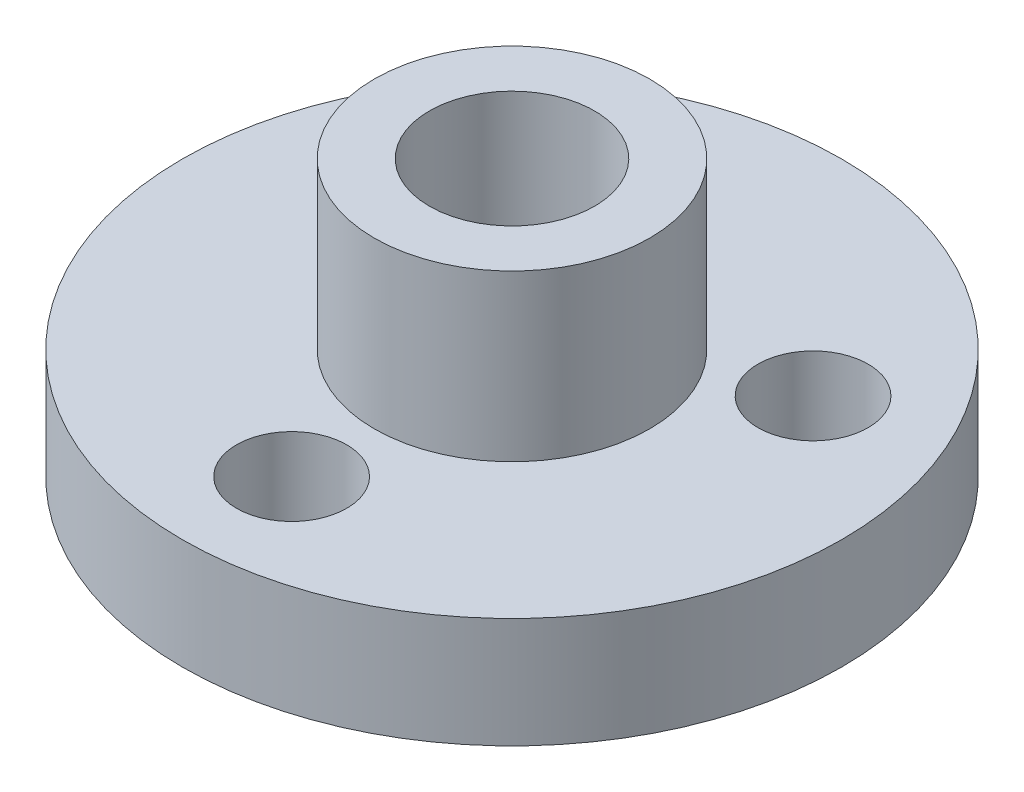
ISO-10303-21;
HEADER;
FILE_DESCRIPTION(('STEP AP214'),'2;1');
FILE_NAME('part.step','',(''),(''),'','','');
FILE_SCHEMA(('AUTOMOTIVE_DESIGN { 1 0 10303 214 1 1 1 1 }'));
ENDSEC;
DATA;
#1=APPLICATION_CONTEXT('core data for automotive mechanical design processes');
#2=APPLICATION_PROTOCOL_DEFINITION('international standard','automotive_design',2000,#1);
#3=PRODUCT_CONTEXT('',#1,'mechanical');
#4=PRODUCT('Part','Part','',(#3));
#5=PRODUCT_RELATED_PRODUCT_CATEGORY('part','',(#4));
#6=PRODUCT_DEFINITION_FORMATION('','',#4);
#7=PRODUCT_DEFINITION_CONTEXT('part definition',#1,'design');
#8=PRODUCT_DEFINITION('design','',#6,#7);
#9=PRODUCT_DEFINITION_SHAPE('','',#8);
#10=(LENGTH_UNIT() NAMED_UNIT(*) SI_UNIT(.MILLI.,.METRE.));
#11=(NAMED_UNIT(*) PLANE_ANGLE_UNIT() SI_UNIT($,.RADIAN.));
#12=(NAMED_UNIT(*) SI_UNIT($,.STERADIAN.) SOLID_ANGLE_UNIT());
#13=UNCERTAINTY_MEASURE_WITH_UNIT(LENGTH_MEASURE(1.E-05),#10,'distance_accuracy_value','');
#14=(GEOMETRIC_REPRESENTATION_CONTEXT(3) GLOBAL_UNCERTAINTY_ASSIGNED_CONTEXT((#13)) GLOBAL_UNIT_ASSIGNED_CONTEXT((#10,
#11,#12)) REPRESENTATION_CONTEXT('',''));
#15=CARTESIAN_POINT('',(0.,0.,0.));
#16=DIRECTION('',(0.,0.,1.));
#17=DIRECTION('',(1.,0.,0.));
#18=AXIS2_PLACEMENT_3D('',#15,#16,#17);
#19=CARTESIAN_POINT('',(0.,3.18,0.));
#20=DIRECTION('',(0.,-1.,0.));
#21=DIRECTION('',(0.,0.,-1.));
#22=AXIS2_PLACEMENT_3D('',#19,#20,#21);
#23=CYLINDRICAL_SURFACE('',#22,9.5);
#24=CARTESIAN_POINT('',(0.,3.18,0.));
#25=DIRECTION('',(0.,1.,0.));
#26=DIRECTION('',(0.,0.,1.));
#27=AXIS2_PLACEMENT_3D('',#24,#25,#26);
#28=CIRCLE('',#27,9.5);
#29=CARTESIAN_POINT('',(0.,3.18,-9.5));
#30=VERTEX_POINT('',#29);
#31=EDGE_CURVE('E10',#30,#30,#28,.T.);
#32=CARTESIAN_POINT('',(0.,0.,0.));
#33=DIRECTION('',(0.,1.,0.));
#34=DIRECTION('',(0.,0.,1.));
#35=AXIS2_PLACEMENT_3D('',#32,#33,#34);
#36=CIRCLE('',#35,9.5);
#37=CARTESIAN_POINT('',(0.,0.,-9.5));
#38=VERTEX_POINT('',#37);
#39=EDGE_CURVE('E34',#38,#38,#36,.T.);
#40=CARTESIAN_POINT('',(0.,3.18,-9.5));
#41=CARTESIAN_POINT('',(0.,3.146875,-9.5));
#42=CARTESIAN_POINT('',(0.,3.11375,-9.5));
#43=CARTESIAN_POINT('',(0.,3.0475,-9.5));
#44=CARTESIAN_POINT('',(0.,3.014375,-9.5));
#45=CARTESIAN_POINT('',(0.,2.948125,-9.5));
#46=CARTESIAN_POINT('',(0.,2.915,-9.5));
#47=CARTESIAN_POINT('',(0.,2.84875,-9.5));
#48=CARTESIAN_POINT('',(0.,2.815625,-9.5));
#49=CARTESIAN_POINT('',(0.,2.749375,-9.5));
#50=CARTESIAN_POINT('',(0.,2.71625,-9.5));
#51=CARTESIAN_POINT('',(0.,2.65,-9.5));
#52=CARTESIAN_POINT('',(0.,2.616875,-9.5));
#53=CARTESIAN_POINT('',(0.,2.550625,-9.5));
#54=CARTESIAN_POINT('',(0.,2.5175,-9.5));
#55=CARTESIAN_POINT('',(0.,2.45125,-9.5));
#56=CARTESIAN_POINT('',(0.,2.418125,-9.5));
#57=CARTESIAN_POINT('',(0.,2.351875,-9.5));
#58=CARTESIAN_POINT('',(0.,2.31875,-9.5));
#59=CARTESIAN_POINT('',(0.,2.2525,-9.5));
#60=CARTESIAN_POINT('',(0.,2.219375,-9.5));
#61=CARTESIAN_POINT('',(0.,2.153125,-9.5));
#62=CARTESIAN_POINT('',(0.,2.12,-9.5));
#63=CARTESIAN_POINT('',(0.,2.05375,-9.5));
#64=CARTESIAN_POINT('',(0.,2.020625,-9.5));
#65=CARTESIAN_POINT('',(0.,1.954375,-9.5));
#66=CARTESIAN_POINT('',(0.,1.92125,-9.5));
#67=CARTESIAN_POINT('',(0.,1.855,-9.5));
#68=CARTESIAN_POINT('',(0.,1.821875,-9.5));
#69=CARTESIAN_POINT('',(0.,1.755625,-9.5));
#70=CARTESIAN_POINT('',(0.,1.7225,-9.5));
#71=CARTESIAN_POINT('',(0.,1.65625,-9.5));
#72=CARTESIAN_POINT('',(0.,1.623125,-9.5));
#73=CARTESIAN_POINT('',(0.,1.556875,-9.5));
#74=CARTESIAN_POINT('',(0.,1.52375,-9.5));
#75=CARTESIAN_POINT('',(0.,1.4575,-9.5));
#76=CARTESIAN_POINT('',(0.,1.424375,-9.5));
#77=CARTESIAN_POINT('',(0.,1.358125,-9.5));
#78=CARTESIAN_POINT('',(0.,1.325,-9.5));
#79=CARTESIAN_POINT('',(0.,1.25875,-9.5));
#80=CARTESIAN_POINT('',(0.,1.225625,-9.5));
#81=CARTESIAN_POINT('',(0.,1.159375,-9.5));
#82=CARTESIAN_POINT('',(0.,1.12625,-9.5));
#83=CARTESIAN_POINT('',(0.,1.06,-9.5));
#84=CARTESIAN_POINT('',(0.,1.026875,-9.5));
#85=CARTESIAN_POINT('',(0.,0.960625,-9.5));
#86=CARTESIAN_POINT('',(0.,0.9275,-9.5));
#87=CARTESIAN_POINT('',(0.,0.86125,-9.5));
#88=CARTESIAN_POINT('',(0.,0.828125,-9.5));
#89=CARTESIAN_POINT('',(0.,0.761875,-9.5));
#90=CARTESIAN_POINT('',(0.,0.72875,-9.5));
#91=CARTESIAN_POINT('',(0.,0.6625,-9.5));
#92=CARTESIAN_POINT('',(0.,0.629375,-9.5));
#93=CARTESIAN_POINT('',(0.,0.563125,-9.5));
#94=CARTESIAN_POINT('',(0.,0.53,-9.5));
#95=CARTESIAN_POINT('',(0.,0.46375,-9.5));
#96=CARTESIAN_POINT('',(0.,0.430625,-9.5));
#97=CARTESIAN_POINT('',(0.,0.364375,-9.5));
#98=CARTESIAN_POINT('',(0.,0.33125,-9.5));
#99=CARTESIAN_POINT('',(0.,0.265,-9.5));
#100=CARTESIAN_POINT('',(0.,0.231875,-9.5));
#101=CARTESIAN_POINT('',(0.,0.165625,-9.5));
#102=CARTESIAN_POINT('',(0.,0.1325,-9.5));
#103=CARTESIAN_POINT('',(0.,0.06625,-9.5));
#104=CARTESIAN_POINT('',(0.,0.033125,-9.5));
#105=CARTESIAN_POINT('',(0.,0.,-9.5));
#106=B_SPLINE_CURVE_WITH_KNOTS('',3,(#40,#41,#42,#43,#44,#45,#46,#47,#48,#49,#50,#51,#52,#53,
#54,#55,#56,#57,#58,#59,#60,#61,#62,#63,#64,#65,#66,#67,#68,#69,#70,#71,#72,#73,#74,#75,#76,#77,
#78,#79,#80,#81,#82,#83,#84,#85,#86,#87,#88,#89,#90,#91,#92,#93,#94,#95,#96,#97,#98,#99,#100,
#101,#102,#103,#104,#105),.UNSPECIFIED.,.F.,.F.,(4,2,2,2,2,2,2,2,2,2,2,2,2,2,2,2,2,2,2,2,2,2,2,
2,2,2,2,2,2,2,2,2,4),(0.,0.0993749999999996,0.19875,0.298125,0.3975,0.496875,0.59625,0.695625,
0.795,0.894375,0.99375,1.093125,1.1925,1.291875,1.39125,1.490625,1.59,1.689375,1.78875,1.888125,
1.9875,2.086875,2.18625,2.285625,2.385,2.484375,2.58375,2.683125,2.7825,2.881875,2.98125,
3.080625,3.18),.UNSPECIFIED.);
#107=EDGE_CURVE('BSEAM31',#30,#38,#106,.T.);
#108=ORIENTED_EDGE('',*,*,#31,.F.);
#109=ORIENTED_EDGE('',*,*,#39,.T.);
#110=ORIENTED_EDGE('',*,*,#107,.T.);
#111=ORIENTED_EDGE('',*,*,#107,.F.);
#112=EDGE_LOOP('',(#108,#110,#109,#111));
#113=FACE_BOUND('',#112,.T.);
#114=ADVANCED_FACE('F31',(#113),#23,.T.);
#115=CARTESIAN_POINT('',(0.,3.18,0.));
#116=DIRECTION('',(0.,1.,0.));
#117=DIRECTION('',(0.,0.,1.));
#118=AXIS2_PLACEMENT_3D('',#115,#116,#117);
#119=PLANE('',#118);
#120=CARTESIAN_POINT('',(5.49926131403121,3.18,-3.17499999999995));
#121=DIRECTION('',(0.,1.,0.));
#122=DIRECTION('',(0.,0.,1.));
#123=AXIS2_PLACEMENT_3D('',#120,#121,#122);
#124=CIRCLE('',#123,1.5875);
#125=CARTESIAN_POINT('',(5.49926131403121,3.18,-1.58749999999995));
#126=VERTEX_POINT('',#125);
#127=EDGE_CURVE('E67',#126,#126,#124,.T.);
#128=ORIENTED_EDGE('',*,*,#127,.F.);
#129=EDGE_LOOP('',(#128));
#130=FACE_BOUND('',#129,.T.);
#131=CARTESIAN_POINT('',(-5.49926131403117,3.18,-3.17500000000003));
#132=DIRECTION('',(0.,1.,0.));
#133=DIRECTION('',(0.,0.,1.));
#134=AXIS2_PLACEMENT_3D('',#131,#132,#133);
#135=CIRCLE('',#134,1.5875);
#136=CARTESIAN_POINT('',(-5.49926131403117,3.18,-1.58750000000003));
#137=VERTEX_POINT('',#136);
#138=EDGE_CURVE('E61',#137,#137,#135,.T.);
#139=ORIENTED_EDGE('',*,*,#138,.F.);
#140=EDGE_LOOP('',(#139));
#141=FACE_BOUND('',#140,.T.);
#142=CARTESIAN_POINT('',(0.,3.18,6.35));
#143=DIRECTION('',(0.,1.,0.));
#144=DIRECTION('',(0.,0.,1.));
#145=AXIS2_PLACEMENT_3D('',#142,#143,#144);
#146=CIRCLE('',#145,1.5875);
#147=CARTESIAN_POINT('',(0.,3.18,7.9375));
#148=VERTEX_POINT('',#147);
#149=EDGE_CURVE('E55',#148,#148,#146,.T.);
#150=ORIENTED_EDGE('',*,*,#149,.F.);
#151=EDGE_LOOP('',(#150));
#152=FACE_BOUND('',#151,.T.);
#153=CARTESIAN_POINT('',(0.,3.18,0.));
#154=DIRECTION('',(0.,1.,0.));
#155=DIRECTION('',(0.,0.,1.));
#156=AXIS2_PLACEMENT_3D('',#153,#154,#155);
#157=CIRCLE('',#156,3.97);
#158=CARTESIAN_POINT('',(0.,3.18,3.97));
#159=VERTEX_POINT('',#158);
#160=EDGE_CURVE('E43',#159,#159,#157,.T.);
#161=ORIENTED_EDGE('',*,*,#160,.F.);
#162=EDGE_LOOP('',(#161));
#163=FACE_BOUND('',#162,.T.);
#164=ORIENTED_EDGE('',*,*,#31,.T.);
#165=EDGE_LOOP('',(#164));
#166=FACE_BOUND('',#165,.T.);
#167=ADVANCED_FACE('F83',(#130,#141,#152,#163,#166),#119,.T.);
#168=CARTESIAN_POINT('',(0.,0.,0.));
#169=DIRECTION('',(0.,1.,0.));
#170=DIRECTION('',(0.,0.,1.));
#171=AXIS2_PLACEMENT_3D('',#168,#169,#170);
#172=PLANE('',#171);
#173=CARTESIAN_POINT('',(5.49926131403121,0.,-3.17499999999995));
#174=DIRECTION('',(0.,1.,0.));
#175=DIRECTION('',(0.,0.,1.));
#176=AXIS2_PLACEMENT_3D('',#173,#174,#175);
#177=CIRCLE('',#176,1.5875);
#178=CARTESIAN_POINT('',(5.49926131403121,0.,-1.58749999999995));
#179=VERTEX_POINT('',#178);
#180=EDGE_CURVE('E64',#179,#179,#177,.T.);
#181=ORIENTED_EDGE('',*,*,#180,.T.);
#182=EDGE_LOOP('',(#181));
#183=FACE_BOUND('',#182,.T.);
#184=CARTESIAN_POINT('',(-5.49926131403117,0.,-3.17500000000003));
#185=DIRECTION('',(0.,1.,0.));
#186=DIRECTION('',(0.,0.,1.));
#187=AXIS2_PLACEMENT_3D('',#184,#185,#186);
#188=CIRCLE('',#187,1.5875);
#189=CARTESIAN_POINT('',(-5.49926131403117,0.,-1.58750000000003));
#190=VERTEX_POINT('',#189);
#191=EDGE_CURVE('E58',#190,#190,#188,.T.);
#192=ORIENTED_EDGE('',*,*,#191,.T.);
#193=EDGE_LOOP('',(#192));
#194=FACE_BOUND('',#193,.T.);
#195=CARTESIAN_POINT('',(0.,0.,6.35));
#196=DIRECTION('',(0.,1.,0.));
#197=DIRECTION('',(0.,0.,1.));
#198=AXIS2_PLACEMENT_3D('',#195,#196,#197);
#199=CIRCLE('',#198,1.5875);
#200=CARTESIAN_POINT('',(0.,0.,7.9375));
#201=VERTEX_POINT('',#200);
#202=EDGE_CURVE('E52',#201,#201,#199,.T.);
#203=ORIENTED_EDGE('',*,*,#202,.T.);
#204=EDGE_LOOP('',(#203));
#205=FACE_BOUND('',#204,.T.);
#206=CARTESIAN_POINT('',(0.,0.,0.));
#207=DIRECTION('',(0.,1.,0.));
#208=DIRECTION('',(0.,0.,1.));
#209=AXIS2_PLACEMENT_3D('',#206,#207,#208);
#210=CIRCLE('',#209,2.38);
#211=CARTESIAN_POINT('',(0.,0.,2.38));
#212=VERTEX_POINT('',#211);
#213=EDGE_CURVE('E46',#212,#212,#210,.T.);
#214=ORIENTED_EDGE('',*,*,#213,.T.);
#215=EDGE_LOOP('',(#214));
#216=FACE_BOUND('',#215,.T.);
#217=ORIENTED_EDGE('',*,*,#39,.F.);
#218=EDGE_LOOP('',(#217));
#219=FACE_BOUND('',#218,.T.);
#220=ADVANCED_FACE('F73',(#183,#194,#205,#216,#219),#172,.F.);
#221=CARTESIAN_POINT('',(0.,7.94,0.));
#222=DIRECTION('',(0.,-1.,0.));
#223=DIRECTION('',(0.,0.,-1.));
#224=AXIS2_PLACEMENT_3D('',#221,#222,#223);
#225=CYLINDRICAL_SURFACE('',#224,3.97);
#226=CARTESIAN_POINT('',(0.,7.94,0.));
#227=DIRECTION('',(0.,1.,0.));
#228=DIRECTION('',(0.,0.,1.));
#229=AXIS2_PLACEMENT_3D('',#226,#227,#228);
#230=CIRCLE('',#229,3.97);
#231=CARTESIAN_POINT('',(0.,7.94,3.97));
#232=VERTEX_POINT('',#231);
#233=EDGE_CURVE('E41',#232,#232,#230,.T.);
#234=ORIENTED_EDGE('',*,*,#233,.F.);
#235=EDGE_LOOP('',(#234));
#236=FACE_BOUND('',#235,.T.);
#237=ORIENTED_EDGE('',*,*,#160,.T.);
#238=EDGE_LOOP('',(#237));
#239=FACE_BOUND('',#238,.T.);
#240=ADVANCED_FACE('F93',(#236,#239),#225,.T.);
#241=CARTESIAN_POINT('',(0.,7.94,0.));
#242=DIRECTION('',(0.,1.,0.));
#243=DIRECTION('',(0.,0.,1.));
#244=AXIS2_PLACEMENT_3D('',#241,#242,#243);
#245=PLANE('',#244);
#246=CARTESIAN_POINT('',(0.,7.94,0.));
#247=DIRECTION('',(0.,1.,0.));
#248=DIRECTION('',(0.,0.,1.));
#249=AXIS2_PLACEMENT_3D('',#246,#247,#248);
#250=CIRCLE('',#249,2.38);
#251=CARTESIAN_POINT('',(0.,7.94,2.38));
#252=VERTEX_POINT('',#251);
#253=EDGE_CURVE('E49',#252,#252,#250,.T.);
#254=ORIENTED_EDGE('',*,*,#253,.F.);
#255=EDGE_LOOP('',(#254));
#256=FACE_BOUND('',#255,.T.);
#257=ORIENTED_EDGE('',*,*,#233,.T.);
#258=EDGE_LOOP('',(#257));
#259=FACE_BOUND('',#258,.T.);
#260=ADVANCED_FACE('F95',(#256,#259),#245,.T.);
#261=CARTESIAN_POINT('',(0.,0.,0.));
#262=DIRECTION('',(0.,1.,0.));
#263=DIRECTION('',(0.,0.,1.));
#264=AXIS2_PLACEMENT_3D('',#261,#262,#263);
#265=CYLINDRICAL_SURFACE('',#264,2.38);
#266=ORIENTED_EDGE('',*,*,#213,.F.);
#267=EDGE_LOOP('',(#266));
#268=FACE_BOUND('',#267,.T.);
#269=ORIENTED_EDGE('',*,*,#253,.T.);
#270=EDGE_LOOP('',(#269));
#271=FACE_BOUND('',#270,.T.);
#272=ADVANCED_FACE('F102',(#268,#271),#265,.F.);
#273=CARTESIAN_POINT('',(0.,0.,6.35));
#274=DIRECTION('',(0.,1.,0.));
#275=DIRECTION('',(0.,0.,1.));
#276=AXIS2_PLACEMENT_3D('',#273,#274,#275);
#277=CYLINDRICAL_SURFACE('',#276,1.5875);
#278=CARTESIAN_POINT('',(0.,0.,7.9375));
#279=CARTESIAN_POINT('',(0.,0.033125,7.9375));
#280=CARTESIAN_POINT('',(0.,0.06625,7.9375));
#281=CARTESIAN_POINT('',(0.,0.1325,7.9375));
#282=CARTESIAN_POINT('',(0.,0.165625,7.9375));
#283=CARTESIAN_POINT('',(0.,0.231875,7.9375));
#284=CARTESIAN_POINT('',(0.,0.265,7.9375));
#285=CARTESIAN_POINT('',(0.,0.33125,7.9375));
#286=CARTESIAN_POINT('',(0.,0.364375,7.9375));
#287=CARTESIAN_POINT('',(0.,0.430625,7.9375));
#288=CARTESIAN_POINT('',(0.,0.46375,7.9375));
#289=CARTESIAN_POINT('',(0.,0.53,7.9375));
#290=CARTESIAN_POINT('',(0.,0.563125,7.9375));
#291=CARTESIAN_POINT('',(0.,0.629375,7.9375));
#292=CARTESIAN_POINT('',(0.,0.6625,7.9375));
#293=CARTESIAN_POINT('',(0.,0.72875,7.9375));
#294=CARTESIAN_POINT('',(0.,0.761875,7.9375));
#295=CARTESIAN_POINT('',(0.,0.828125,7.9375));
#296=CARTESIAN_POINT('',(0.,0.86125,7.9375));
#297=CARTESIAN_POINT('',(0.,0.9275,7.9375));
#298=CARTESIAN_POINT('',(0.,0.960625,7.9375));
#299=CARTESIAN_POINT('',(0.,1.026875,7.9375));
#300=CARTESIAN_POINT('',(0.,1.06,7.9375));
#301=CARTESIAN_POINT('',(0.,1.12625,7.9375));
#302=CARTESIAN_POINT('',(0.,1.159375,7.9375));
#303=CARTESIAN_POINT('',(0.,1.225625,7.9375));
#304=CARTESIAN_POINT('',(0.,1.25875,7.9375));
#305=CARTESIAN_POINT('',(0.,1.325,7.9375));
#306=CARTESIAN_POINT('',(0.,1.358125,7.9375));
#307=CARTESIAN_POINT('',(0.,1.424375,7.9375));
#308=CARTESIAN_POINT('',(0.,1.4575,7.9375));
#309=CARTESIAN_POINT('',(0.,1.52375,7.9375));
#310=CARTESIAN_POINT('',(0.,1.556875,7.9375));
#311=CARTESIAN_POINT('',(0.,1.623125,7.9375));
#312=CARTESIAN_POINT('',(0.,1.65625,7.9375));
#313=CARTESIAN_POINT('',(0.,1.7225,7.9375));
#314=CARTESIAN_POINT('',(0.,1.755625,7.9375));
#315=CARTESIAN_POINT('',(0.,1.821875,7.9375));
#316=CARTESIAN_POINT('',(0.,1.855,7.9375));
#317=CARTESIAN_POINT('',(0.,1.92125,7.9375));
#318=CARTESIAN_POINT('',(0.,1.954375,7.9375));
#319=CARTESIAN_POINT('',(0.,2.020625,7.9375));
#320=CARTESIAN_POINT('',(0.,2.05375,7.9375));
#321=CARTESIAN_POINT('',(0.,2.12,7.9375));
#322=CARTESIAN_POINT('',(0.,2.153125,7.9375));
#323=CARTESIAN_POINT('',(0.,2.219375,7.9375));
#324=CARTESIAN_POINT('',(0.,2.2525,7.9375));
#325=CARTESIAN_POINT('',(0.,2.31875,7.9375));
#326=CARTESIAN_POINT('',(0.,2.351875,7.9375));
#327=CARTESIAN_POINT('',(0.,2.418125,7.9375));
#328=CARTESIAN_POINT('',(0.,2.45125,7.9375));
#329=CARTESIAN_POINT('',(0.,2.5175,7.9375));
#330=CARTESIAN_POINT('',(0.,2.550625,7.9375));
#331=CARTESIAN_POINT('',(0.,2.616875,7.9375));
#332=CARTESIAN_POINT('',(0.,2.65,7.9375));
#333=CARTESIAN_POINT('',(0.,2.71625,7.9375));
#334=CARTESIAN_POINT('',(0.,2.749375,7.9375));
#335=CARTESIAN_POINT('',(0.,2.815625,7.9375));
#336=CARTESIAN_POINT('',(0.,2.84875,7.9375));
#337=CARTESIAN_POINT('',(0.,2.915,7.9375));
#338=CARTESIAN_POINT('',(0.,2.948125,7.9375));
#339=CARTESIAN_POINT('',(0.,3.014375,7.9375));
#340=CARTESIAN_POINT('',(0.,3.0475,7.9375));
#341=CARTESIAN_POINT('',(0.,3.11375,7.9375));
#342=CARTESIAN_POINT('',(0.,3.146875,7.9375));
#343=CARTESIAN_POINT('',(0.,3.18,7.9375));
#344=B_SPLINE_CURVE_WITH_KNOTS('',3,(#278,#279,#280,#281,#282,#283,#284,#285,#286,#287,#288,
#289,#290,#291,#292,#293,#294,#295,#296,#297,#298,#299,#300,#301,#302,#303,#304,#305,#306,#307,
#308,#309,#310,#311,#312,#313,#314,#315,#316,#317,#318,#319,#320,#321,#322,#323,#324,#325,#326,
#327,#328,#329,#330,#331,#332,#333,#334,#335,#336,#337,#338,#339,#340,#341,#342,#343),
.UNSPECIFIED.,.F.,.F.,(4,2,2,2,2,2,2,2,2,2,2,2,2,2,2,2,2,2,2,2,2,2,2,2,2,2,2,2,2,2,2,2,4),(0.,
0.099375,0.19875,0.298125,0.3975,0.496875,0.59625,0.695625,0.795,0.894375,0.99375,1.093125,
1.1925,1.291875,1.39125,1.490625,1.59,1.689375,1.78875,1.888125,1.9875,2.086875,2.18625,
2.285625,2.385,2.484375,2.58375,2.683125,2.7825,2.881875,2.98125,3.080625,3.18),.UNSPECIFIED.);
#345=EDGE_CURVE('BSEAM128',#201,#148,#344,.T.);
#346=ORIENTED_EDGE('',*,*,#202,.F.);
#347=ORIENTED_EDGE('',*,*,#149,.T.);
#348=ORIENTED_EDGE('',*,*,#345,.T.);
#349=ORIENTED_EDGE('',*,*,#345,.F.);
#350=EDGE_LOOP('',(#346,#348,#347,#349));
#351=FACE_BOUND('',#350,.T.);
#352=ADVANCED_FACE('F128',(#351),#277,.F.);
#353=CARTESIAN_POINT('',(-5.49926131403117,0.,-3.17500000000003));
#354=DIRECTION('',(0.,1.,0.));
#355=DIRECTION('',(0.,0.,1.));
#356=AXIS2_PLACEMENT_3D('',#353,#354,#355);
#357=CYLINDRICAL_SURFACE('',#356,1.5875);
#358=CARTESIAN_POINT('',(-5.49926131403117,0.,-1.58750000000003));
#359=CARTESIAN_POINT('',(-5.49926131403117,0.033125,-1.58750000000003));
#360=CARTESIAN_POINT('',(-5.49926131403117,0.06625,-1.58750000000003));
#361=CARTESIAN_POINT('',(-5.49926131403117,0.1325,-1.58750000000003));
#362=CARTESIAN_POINT('',(-5.49926131403117,0.165625,-1.58750000000003));
#363=CARTESIAN_POINT('',(-5.49926131403117,0.231875,-1.58750000000003));
#364=CARTESIAN_POINT('',(-5.49926131403117,0.265,-1.58750000000003));
#365=CARTESIAN_POINT('',(-5.49926131403117,0.33125,-1.58750000000003));
#366=CARTESIAN_POINT('',(-5.49926131403117,0.364375,-1.58750000000003));
#367=CARTESIAN_POINT('',(-5.49926131403117,0.430625,-1.58750000000003));
#368=CARTESIAN_POINT('',(-5.49926131403117,0.46375,-1.58750000000003));
#369=CARTESIAN_POINT('',(-5.49926131403117,0.53,-1.58750000000003));
#370=CARTESIAN_POINT('',(-5.49926131403117,0.563125,-1.58750000000003));
#371=CARTESIAN_POINT('',(-5.49926131403117,0.629375,-1.58750000000003));
#372=CARTESIAN_POINT('',(-5.49926131403117,0.6625,-1.58750000000003));
#373=CARTESIAN_POINT('',(-5.49926131403117,0.72875,-1.58750000000003));
#374=CARTESIAN_POINT('',(-5.49926131403117,0.761875,-1.58750000000003));
#375=CARTESIAN_POINT('',(-5.49926131403117,0.828125,-1.58750000000003));
#376=CARTESIAN_POINT('',(-5.49926131403117,0.86125,-1.58750000000003));
#377=CARTESIAN_POINT('',(-5.49926131403117,0.9275,-1.58750000000003));
#378=CARTESIAN_POINT('',(-5.49926131403117,0.960625,-1.58750000000003));
#379=CARTESIAN_POINT('',(-5.49926131403117,1.026875,-1.58750000000003));
#380=CARTESIAN_POINT('',(-5.49926131403117,1.06,-1.58750000000003));
#381=CARTESIAN_POINT('',(-5.49926131403117,1.12625,-1.58750000000003));
#382=CARTESIAN_POINT('',(-5.49926131403117,1.159375,-1.58750000000003));
#383=CARTESIAN_POINT('',(-5.49926131403117,1.225625,-1.58750000000003));
#384=CARTESIAN_POINT('',(-5.49926131403117,1.25875,-1.58750000000003));
#385=CARTESIAN_POINT('',(-5.49926131403117,1.325,-1.58750000000003));
#386=CARTESIAN_POINT('',(-5.49926131403117,1.358125,-1.58750000000003));
#387=CARTESIAN_POINT('',(-5.49926131403117,1.424375,-1.58750000000003));
#388=CARTESIAN_POINT('',(-5.49926131403117,1.4575,-1.58750000000003));
#389=CARTESIAN_POINT('',(-5.49926131403117,1.52375,-1.58750000000003));
#390=CARTESIAN_POINT('',(-5.49926131403117,1.556875,-1.58750000000003));
#391=CARTESIAN_POINT('',(-5.49926131403117,1.623125,-1.58750000000003));
#392=CARTESIAN_POINT('',(-5.49926131403117,1.65625,-1.58750000000003));
#393=CARTESIAN_POINT('',(-5.49926131403117,1.7225,-1.58750000000003));
#394=CARTESIAN_POINT('',(-5.49926131403117,1.755625,-1.58750000000003));
#395=CARTESIAN_POINT('',(-5.49926131403117,1.821875,-1.58750000000003));
#396=CARTESIAN_POINT('',(-5.49926131403117,1.855,-1.58750000000003));
#397=CARTESIAN_POINT('',(-5.49926131403117,1.92125,-1.58750000000003));
#398=CARTESIAN_POINT('',(-5.49926131403117,1.954375,-1.58750000000003));
#399=CARTESIAN_POINT('',(-5.49926131403117,2.020625,-1.58750000000003));
#400=CARTESIAN_POINT('',(-5.49926131403117,2.05375,-1.58750000000003));
#401=CARTESIAN_POINT('',(-5.49926131403117,2.12,-1.58750000000003));
#402=CARTESIAN_POINT('',(-5.49926131403117,2.153125,-1.58750000000003));
#403=CARTESIAN_POINT('',(-5.49926131403117,2.219375,-1.58750000000003));
#404=CARTESIAN_POINT('',(-5.49926131403117,2.2525,-1.58750000000003));
#405=CARTESIAN_POINT('',(-5.49926131403117,2.31875,-1.58750000000003));
#406=CARTESIAN_POINT('',(-5.49926131403117,2.351875,-1.58750000000003));
#407=CARTESIAN_POINT('',(-5.49926131403117,2.418125,-1.58750000000003));
#408=CARTESIAN_POINT('',(-5.49926131403117,2.45125,-1.58750000000003));
#409=CARTESIAN_POINT('',(-5.49926131403117,2.5175,-1.58750000000003));
#410=CARTESIAN_POINT('',(-5.49926131403117,2.550625,-1.58750000000003));
#411=CARTESIAN_POINT('',(-5.49926131403117,2.616875,-1.58750000000003));
#412=CARTESIAN_POINT('',(-5.49926131403117,2.65,-1.58750000000003));
#413=CARTESIAN_POINT('',(-5.49926131403117,2.71625,-1.58750000000003));
#414=CARTESIAN_POINT('',(-5.49926131403117,2.749375,-1.58750000000003));
#415=CARTESIAN_POINT('',(-5.49926131403117,2.815625,-1.58750000000003));
#416=CARTESIAN_POINT('',(-5.49926131403117,2.84875,-1.58750000000003));
#417=CARTESIAN_POINT('',(-5.49926131403117,2.915,-1.58750000000003));
#418=CARTESIAN_POINT('',(-5.49926131403117,2.948125,-1.58750000000003));
#419=CARTESIAN_POINT('',(-5.49926131403117,3.014375,-1.58750000000003));
#420=CARTESIAN_POINT('',(-5.49926131403117,3.0475,-1.58750000000003));
#421=CARTESIAN_POINT('',(-5.49926131403117,3.11375,-1.58750000000003));
#422=CARTESIAN_POINT('',(-5.49926131403117,3.146875,-1.58750000000003));
#423=CARTESIAN_POINT('',(-5.49926131403117,3.18,-1.58750000000003));
#424=B_SPLINE_CURVE_WITH_KNOTS('',3,(#358,#359,#360,#361,#362,#363,#364,#365,#366,#367,#368,
#369,#370,#371,#372,#373,#374,#375,#376,#377,#378,#379,#380,#381,#382,#383,#384,#385,#386,#387,
#388,#389,#390,#391,#392,#393,#394,#395,#396,#397,#398,#399,#400,#401,#402,#403,#404,#405,#406,
#407,#408,#409,#410,#411,#412,#413,#414,#415,#416,#417,#418,#419,#420,#421,#422,#423),
.UNSPECIFIED.,.F.,.F.,(4,2,2,2,2,2,2,2,2,2,2,2,2,2,2,2,2,2,2,2,2,2,2,2,2,2,2,2,2,2,2,2,4),(0.,
0.099375,0.19875,0.298125,0.3975,0.496875,0.59625,0.695625,0.795,0.894375,0.99375,1.093125,
1.1925,1.291875,1.39125,1.490625,1.59,1.689375,1.78875,1.888125,1.9875,2.086875,2.18625,
2.285625,2.385,2.484375,2.58375,2.683125,2.7825,2.881875,2.98125,3.080625,3.18),.UNSPECIFIED.);
#425=EDGE_CURVE('BSEAM79',#190,#137,#424,.T.);
#426=ORIENTED_EDGE('',*,*,#191,.F.);
#427=ORIENTED_EDGE('',*,*,#138,.T.);
#428=ORIENTED_EDGE('',*,*,#425,.T.);
#429=ORIENTED_EDGE('',*,*,#425,.F.);
#430=EDGE_LOOP('',(#426,#428,#427,#429));
#431=FACE_BOUND('',#430,.T.);
#432=ADVANCED_FACE('F79',(#431),#357,.F.);
#433=CARTESIAN_POINT('',(5.49926131403121,0.,-3.17499999999995));
#434=DIRECTION('',(0.,1.,0.));
#435=DIRECTION('',(0.,0.,1.));
#436=AXIS2_PLACEMENT_3D('',#433,#434,#435);
#437=CYLINDRICAL_SURFACE('',#436,1.5875);
#438=CARTESIAN_POINT('',(5.49926131403121,0.,-1.58749999999995));
#439=CARTESIAN_POINT('',(5.49926131403121,0.033125,-1.58749999999995));
#440=CARTESIAN_POINT('',(5.49926131403121,0.06625,-1.58749999999995));
#441=CARTESIAN_POINT('',(5.49926131403121,0.1325,-1.58749999999995));
#442=CARTESIAN_POINT('',(5.49926131403121,0.165625,-1.58749999999995));
#443=CARTESIAN_POINT('',(5.49926131403121,0.231875,-1.58749999999995));
#444=CARTESIAN_POINT('',(5.49926131403121,0.265,-1.58749999999995));
#445=CARTESIAN_POINT('',(5.49926131403121,0.33125,-1.58749999999995));
#446=CARTESIAN_POINT('',(5.49926131403121,0.364375,-1.58749999999995));
#447=CARTESIAN_POINT('',(5.49926131403121,0.430625,-1.58749999999995));
#448=CARTESIAN_POINT('',(5.49926131403121,0.46375,-1.58749999999995));
#449=CARTESIAN_POINT('',(5.49926131403121,0.53,-1.58749999999995));
#450=CARTESIAN_POINT('',(5.49926131403121,0.563125,-1.58749999999995));
#451=CARTESIAN_POINT('',(5.49926131403121,0.629375,-1.58749999999995));
#452=CARTESIAN_POINT('',(5.49926131403121,0.6625,-1.58749999999995));
#453=CARTESIAN_POINT('',(5.49926131403121,0.72875,-1.58749999999995));
#454=CARTESIAN_POINT('',(5.49926131403121,0.761875,-1.58749999999995));
#455=CARTESIAN_POINT('',(5.49926131403121,0.828125,-1.58749999999995));
#456=CARTESIAN_POINT('',(5.49926131403121,0.86125,-1.58749999999995));
#457=CARTESIAN_POINT('',(5.49926131403121,0.9275,-1.58749999999995));
#458=CARTESIAN_POINT('',(5.49926131403121,0.960625,-1.58749999999995));
#459=CARTESIAN_POINT('',(5.49926131403121,1.026875,-1.58749999999995));
#460=CARTESIAN_POINT('',(5.49926131403121,1.06,-1.58749999999995));
#461=CARTESIAN_POINT('',(5.49926131403121,1.12625,-1.58749999999995));
#462=CARTESIAN_POINT('',(5.49926131403121,1.159375,-1.58749999999995));
#463=CARTESIAN_POINT('',(5.49926131403121,1.225625,-1.58749999999995));
#464=CARTESIAN_POINT('',(5.49926131403121,1.25875,-1.58749999999995));
#465=CARTESIAN_POINT('',(5.49926131403121,1.325,-1.58749999999995));
#466=CARTESIAN_POINT('',(5.49926131403121,1.358125,-1.58749999999995));
#467=CARTESIAN_POINT('',(5.49926131403121,1.424375,-1.58749999999995));
#468=CARTESIAN_POINT('',(5.49926131403121,1.4575,-1.58749999999995));
#469=CARTESIAN_POINT('',(5.49926131403121,1.52375,-1.58749999999995));
#470=CARTESIAN_POINT('',(5.49926131403121,1.556875,-1.58749999999995));
#471=CARTESIAN_POINT('',(5.49926131403121,1.623125,-1.58749999999995));
#472=CARTESIAN_POINT('',(5.49926131403121,1.65625,-1.58749999999995));
#473=CARTESIAN_POINT('',(5.49926131403121,1.7225,-1.58749999999995));
#474=CARTESIAN_POINT('',(5.49926131403121,1.755625,-1.58749999999995));
#475=CARTESIAN_POINT('',(5.49926131403121,1.821875,-1.58749999999995));
#476=CARTESIAN_POINT('',(5.49926131403121,1.855,-1.58749999999995));
#477=CARTESIAN_POINT('',(5.49926131403121,1.92125,-1.58749999999995));
#478=CARTESIAN_POINT('',(5.49926131403121,1.954375,-1.58749999999995));
#479=CARTESIAN_POINT('',(5.49926131403121,2.020625,-1.58749999999995));
#480=CARTESIAN_POINT('',(5.49926131403121,2.05375,-1.58749999999995));
#481=CARTESIAN_POINT('',(5.49926131403121,2.12,-1.58749999999995));
#482=CARTESIAN_POINT('',(5.49926131403121,2.153125,-1.58749999999995));
#483=CARTESIAN_POINT('',(5.49926131403121,2.219375,-1.58749999999995));
#484=CARTESIAN_POINT('',(5.49926131403121,2.2525,-1.58749999999995));
#485=CARTESIAN_POINT('',(5.49926131403121,2.31875,-1.58749999999995));
#486=CARTESIAN_POINT('',(5.49926131403121,2.351875,-1.58749999999995));
#487=CARTESIAN_POINT('',(5.49926131403121,2.418125,-1.58749999999995));
#488=CARTESIAN_POINT('',(5.49926131403121,2.45125,-1.58749999999995));
#489=CARTESIAN_POINT('',(5.49926131403121,2.5175,-1.58749999999995));
#490=CARTESIAN_POINT('',(5.49926131403121,2.550625,-1.58749999999995));
#491=CARTESIAN_POINT('',(5.49926131403121,2.616875,-1.58749999999995));
#492=CARTESIAN_POINT('',(5.49926131403121,2.65,-1.58749999999995));
#493=CARTESIAN_POINT('',(5.49926131403121,2.71625,-1.58749999999995));
#494=CARTESIAN_POINT('',(5.49926131403121,2.749375,-1.58749999999995));
#495=CARTESIAN_POINT('',(5.49926131403121,2.815625,-1.58749999999995));
#496=CARTESIAN_POINT('',(5.49926131403121,2.84875,-1.58749999999995));
#497=CARTESIAN_POINT('',(5.49926131403121,2.915,-1.58749999999995));
#498=CARTESIAN_POINT('',(5.49926131403121,2.948125,-1.58749999999995));
#499=CARTESIAN_POINT('',(5.49926131403121,3.014375,-1.58749999999995));
#500=CARTESIAN_POINT('',(5.49926131403121,3.0475,-1.58749999999995));
#501=CARTESIAN_POINT('',(5.49926131403121,3.11375,-1.58749999999995));
#502=CARTESIAN_POINT('',(5.49926131403121,3.146875,-1.58749999999995));
#503=CARTESIAN_POINT('',(5.49926131403121,3.18,-1.58749999999995));
#504=B_SPLINE_CURVE_WITH_KNOTS('',3,(#438,#439,#440,#441,#442,#443,#444,#445,#446,#447,#448,
#449,#450,#451,#452,#453,#454,#455,#456,#457,#458,#459,#460,#461,#462,#463,#464,#465,#466,#467,
#468,#469,#470,#471,#472,#473,#474,#475,#476,#477,#478,#479,#480,#481,#482,#483,#484,#485,#486,
#487,#488,#489,#490,#491,#492,#493,#494,#495,#496,#497,#498,#499,#500,#501,#502,#503),
.UNSPECIFIED.,.F.,.F.,(4,2,2,2,2,2,2,2,2,2,2,2,2,2,2,2,2,2,2,2,2,2,2,2,2,2,2,2,2,2,2,2,4),(0.,
0.099375,0.19875,0.298125,0.3975,0.496875,0.59625,0.695625,0.795,0.894375,0.99375,1.093125,
1.1925,1.291875,1.39125,1.490625,1.59,1.689375,1.78875,1.888125,1.9875,2.086875,2.18625,
2.285625,2.385,2.484375,2.58375,2.683125,2.7825,2.881875,2.98125,3.080625,3.18),.UNSPECIFIED.);
#505=EDGE_CURVE('BSEAM76',#179,#126,#504,.T.);
#506=ORIENTED_EDGE('',*,*,#180,.F.);
#507=ORIENTED_EDGE('',*,*,#127,.T.);
#508=ORIENTED_EDGE('',*,*,#505,.T.);
#509=ORIENTED_EDGE('',*,*,#505,.F.);
#510=EDGE_LOOP('',(#506,#508,#507,#509));
#511=FACE_BOUND('',#510,.T.);
#512=ADVANCED_FACE('F76',(#511),#437,.F.);
#513=CLOSED_SHELL('',(#114,#167,#220,#240,#260,#272,#352,#432,#512));
#514=MANIFOLD_SOLID_BREP('B2',#513);
#515=ADVANCED_BREP_SHAPE_REPRESENTATION('',(#18,#514),#14);
#516=SHAPE_DEFINITION_REPRESENTATION(#9,#515);
ENDSEC;
END-ISO-10303-21;
